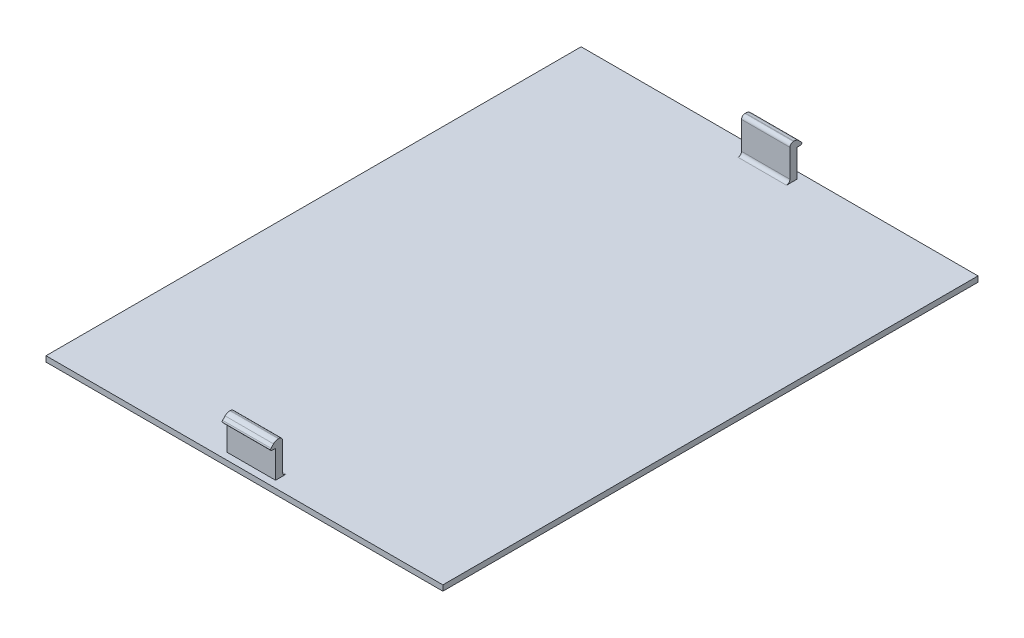
ISO-10303-21;
HEADER;
FILE_DESCRIPTION(('STEP AP214'),'2;1');
FILE_NAME('part.step','',(''),(''),'','','');
FILE_SCHEMA(('AUTOMOTIVE_DESIGN { 1 0 10303 214 1 1 1 1 }'));
ENDSEC;
DATA;
#1=APPLICATION_CONTEXT('core data for automotive mechanical design processes');
#2=APPLICATION_PROTOCOL_DEFINITION('international standard','automotive_design',2000,#1);
#3=PRODUCT_CONTEXT('',#1,'mechanical');
#4=PRODUCT('Part','Part','',(#3));
#5=PRODUCT_RELATED_PRODUCT_CATEGORY('part','',(#4));
#6=PRODUCT_DEFINITION_FORMATION('','',#4);
#7=PRODUCT_DEFINITION_CONTEXT('part definition',#1,'design');
#8=PRODUCT_DEFINITION('design','',#6,#7);
#9=PRODUCT_DEFINITION_SHAPE('','',#8);
#10=(LENGTH_UNIT() NAMED_UNIT(*) SI_UNIT(.MILLI.,.METRE.));
#11=(NAMED_UNIT(*) PLANE_ANGLE_UNIT() SI_UNIT($,.RADIAN.));
#12=(NAMED_UNIT(*) SI_UNIT($,.STERADIAN.) SOLID_ANGLE_UNIT());
#13=UNCERTAINTY_MEASURE_WITH_UNIT(LENGTH_MEASURE(1.E-05),#10,'distance_accuracy_value','');
#14=(GEOMETRIC_REPRESENTATION_CONTEXT(3) GLOBAL_UNCERTAINTY_ASSIGNED_CONTEXT((#13)) GLOBAL_UNIT_ASSIGNED_CONTEXT((#10,
#11,#12)) REPRESENTATION_CONTEXT('',''));
#15=CARTESIAN_POINT('',(0.,0.,0.));
#16=DIRECTION('',(0.,0.,1.));
#17=DIRECTION('',(1.,0.,0.));
#18=AXIS2_PLACEMENT_3D('',#15,#16,#17);
#19=CARTESIAN_POINT('',(0.,0.8,0.));
#20=DIRECTION('',(0.,1.,0.));
#21=DIRECTION('',(0.,0.,1.));
#22=AXIS2_PLACEMENT_3D('',#19,#20,#21);
#23=PLANE('',#22);
#24=DIRECTION('',(-1.,0.,0.));
#25=VECTOR('',#24,1.);
#26=CARTESIAN_POINT('',(0.,0.8,-36.2));
#27=LINE('',#26,#25);
#28=CARTESIAN_POINT('',(3.5,0.8,-36.2));
#29=VERTEX_POINT('',#28);
#30=CARTESIAN_POINT('',(-3.5,0.8,-36.2));
#31=VERTEX_POINT('',#30);
#32=EDGE_CURVE('E367',#29,#31,#27,.T.);
#33=ORIENTED_EDGE('',*,*,#32,.T.);
#34=DIRECTION('',(0.,0.,-1.));
#35=VECTOR('',#34,1.);
#36=CARTESIAN_POINT('',(-3.5,0.8,-36.7));
#37=LINE('',#36,#35);
#38=CARTESIAN_POINT('',(-3.5,0.8,-37.7));
#39=VERTEX_POINT('',#38);
#40=EDGE_CURVE('E218',#31,#39,#37,.T.);
#41=ORIENTED_EDGE('',*,*,#40,.T.);
#42=DIRECTION('',(-1.,0.,0.));
#43=VECTOR('',#42,1.);
#44=CARTESIAN_POINT('',(3.5,0.8,-37.7));
#45=LINE('',#44,#43);
#46=CARTESIAN_POINT('',(3.5,0.8,-37.7));
#47=VERTEX_POINT('',#46);
#48=EDGE_CURVE('E266',#47,#39,#45,.T.);
#49=ORIENTED_EDGE('',*,*,#48,.F.);
#50=DIRECTION('',(0.,0.,-1.));
#51=VECTOR('',#50,1.);
#52=CARTESIAN_POINT('',(3.5,0.8,-36.7));
#53=LINE('',#52,#51);
#54=EDGE_CURVE('E238',#29,#47,#53,.T.);
#55=ORIENTED_EDGE('',*,*,#54,.F.);
#56=EDGE_LOOP('',(#33,#41,#49,#55));
#57=FACE_BOUND('',#56,.T.);
#58=DIRECTION('',(0.,0.,1.));
#59=VECTOR('',#58,1.);
#60=CARTESIAN_POINT('',(-28.7,0.8,-38.7));
#61=LINE('',#60,#59);
#62=CARTESIAN_POINT('',(-28.7,0.8,-38.7));
#63=VERTEX_POINT('',#62);
#64=CARTESIAN_POINT('',(-28.7,0.8,38.7));
#65=VERTEX_POINT('',#64);
#66=EDGE_CURVE('E269',#63,#65,#61,.T.);
#67=ORIENTED_EDGE('',*,*,#66,.T.);
#68=DIRECTION('',(1.,0.,0.));
#69=VECTOR('',#68,1.);
#70=CARTESIAN_POINT('',(-28.7,0.8,38.7));
#71=LINE('',#70,#69);
#72=CARTESIAN_POINT('',(28.7,0.8,38.7));
#73=VERTEX_POINT('',#72);
#74=EDGE_CURVE('E272',#65,#73,#71,.T.);
#75=ORIENTED_EDGE('',*,*,#74,.T.);
#76=DIRECTION('',(0.,0.,-1.));
#77=VECTOR('',#76,1.);
#78=CARTESIAN_POINT('',(28.7,0.8,-38.7));
#79=LINE('',#78,#77);
#80=CARTESIAN_POINT('',(28.7,0.8,-38.7));
#81=VERTEX_POINT('',#80);
#82=EDGE_CURVE('E275',#73,#81,#79,.T.);
#83=ORIENTED_EDGE('',*,*,#82,.T.);
#84=DIRECTION('',(-1.,0.,0.));
#85=VECTOR('',#84,1.);
#86=CARTESIAN_POINT('',(-28.7,0.8,-38.7));
#87=LINE('',#86,#85);
#88=EDGE_CURVE('E277',#81,#63,#87,.T.);
#89=ORIENTED_EDGE('',*,*,#88,.T.);
#90=EDGE_LOOP('',(#67,#75,#83,#89));
#91=FACE_BOUND('',#90,.T.);
#92=DIRECTION('',(0.,0.,-1.));
#93=VECTOR('',#92,1.);
#94=CARTESIAN_POINT('',(-3.5,0.8,36.7));
#95=LINE('',#94,#93);
#96=CARTESIAN_POINT('',(-3.5,0.8,37.7));
#97=VERTEX_POINT('',#96);
#98=CARTESIAN_POINT('',(-3.5,0.8,36.2));
#99=VERTEX_POINT('',#98);
#100=EDGE_CURVE('E234',#97,#99,#95,.T.);
#101=ORIENTED_EDGE('',*,*,#100,.T.);
#102=DIRECTION('',(-1.,0.,0.));
#103=VECTOR('',#102,1.);
#104=CARTESIAN_POINT('',(0.,0.8,36.2));
#105=LINE('',#104,#103);
#106=CARTESIAN_POINT('',(3.5,0.8,36.2));
#107=VERTEX_POINT('',#106);
#108=EDGE_CURVE('E370',#99,#107,#105,.F.);
#109=ORIENTED_EDGE('',*,*,#108,.T.);
#110=DIRECTION('',(0.,0.,-1.));
#111=VECTOR('',#110,1.);
#112=CARTESIAN_POINT('',(3.5,0.8,36.7));
#113=LINE('',#112,#111);
#114=CARTESIAN_POINT('',(3.5,0.8,37.7));
#115=VERTEX_POINT('',#114);
#116=EDGE_CURVE('E222',#115,#107,#113,.T.);
#117=ORIENTED_EDGE('',*,*,#116,.F.);
#118=DIRECTION('',(-1.,0.,0.));
#119=VECTOR('',#118,1.);
#120=CARTESIAN_POINT('',(3.5,0.8,37.7));
#121=LINE('',#120,#119);
#122=EDGE_CURVE('E219',#115,#97,#121,.T.);
#123=ORIENTED_EDGE('',*,*,#122,.T.);
#124=EDGE_LOOP('',(#101,#109,#117,#123));
#125=FACE_BOUND('',#124,.T.);
#126=ADVANCED_FACE('F35',(#57,#91,#125),#23,.T.);
#127=CARTESIAN_POINT('',(-28.7,0.8,-38.7));
#128=DIRECTION('',(1.,0.,0.));
#129=DIRECTION('',(0.,0.,-1.));
#130=AXIS2_PLACEMENT_3D('',#127,#128,#129);
#131=PLANE('',#130);
#132=DIRECTION('',(0.,0.,1.));
#133=VECTOR('',#132,1.);
#134=CARTESIAN_POINT('',(-28.7,0.,-38.7));
#135=LINE('',#134,#133);
#136=CARTESIAN_POINT('',(-28.7,0.,-38.7));
#137=VERTEX_POINT('',#136);
#138=CARTESIAN_POINT('',(-28.7,0.,38.7));
#139=VERTEX_POINT('',#138);
#140=EDGE_CURVE('E268',#137,#139,#135,.T.);
#141=ORIENTED_EDGE('',*,*,#140,.T.);
#142=DIRECTION('',(0.,-1.,0.));
#143=VECTOR('',#142,1.);
#144=CARTESIAN_POINT('',(-28.7,0.8,38.7));
#145=LINE('',#144,#143);
#146=EDGE_CURVE('E295',#65,#139,#145,.T.);
#147=ORIENTED_EDGE('',*,*,#146,.F.);
#148=ORIENTED_EDGE('',*,*,#66,.F.);
#149=DIRECTION('',(0.,-1.,0.));
#150=VECTOR('',#149,1.);
#151=CARTESIAN_POINT('',(-28.7,0.8,-38.7));
#152=LINE('',#151,#150);
#153=EDGE_CURVE('E279',#63,#137,#152,.T.);
#154=ORIENTED_EDGE('',*,*,#153,.T.);
#155=EDGE_LOOP('',(#141,#147,#148,#154));
#156=FACE_BOUND('',#155,.T.);
#157=ADVANCED_FACE('F425',(#156),#131,.F.);
#158=CARTESIAN_POINT('',(-28.7,0.8,38.7));
#159=DIRECTION('',(0.,0.,-1.));
#160=DIRECTION('',(-1.,0.,0.));
#161=AXIS2_PLACEMENT_3D('',#158,#159,#160);
#162=PLANE('',#161);
#163=DIRECTION('',(1.,0.,0.));
#164=VECTOR('',#163,1.);
#165=CARTESIAN_POINT('',(-28.7,0.,38.7));
#166=LINE('',#165,#164);
#167=CARTESIAN_POINT('',(28.7,0.,38.7));
#168=VERTEX_POINT('',#167);
#169=EDGE_CURVE('E282',#139,#168,#166,.T.);
#170=ORIENTED_EDGE('',*,*,#169,.T.);
#171=DIRECTION('',(0.,-1.,0.));
#172=VECTOR('',#171,1.);
#173=CARTESIAN_POINT('',(28.7,0.8,38.7));
#174=LINE('',#173,#172);
#175=EDGE_CURVE('E292',#73,#168,#174,.T.);
#176=ORIENTED_EDGE('',*,*,#175,.F.);
#177=ORIENTED_EDGE('',*,*,#74,.F.);
#178=ORIENTED_EDGE('',*,*,#146,.T.);
#179=EDGE_LOOP('',(#170,#176,#177,#178));
#180=FACE_BOUND('',#179,.T.);
#181=ADVANCED_FACE('F433',(#180),#162,.F.);
#182=CARTESIAN_POINT('',(28.7,0.8,-38.7));
#183=DIRECTION('',(-1.,0.,0.));
#184=DIRECTION('',(0.,0.,1.));
#185=AXIS2_PLACEMENT_3D('',#182,#183,#184);
#186=PLANE('',#185);
#187=DIRECTION('',(0.,0.,-1.));
#188=VECTOR('',#187,1.);
#189=CARTESIAN_POINT('',(28.7,0.,-38.7));
#190=LINE('',#189,#188);
#191=CARTESIAN_POINT('',(28.7,0.,-38.7));
#192=VERTEX_POINT('',#191);
#193=EDGE_CURVE('E284',#168,#192,#190,.T.);
#194=ORIENTED_EDGE('',*,*,#193,.T.);
#195=DIRECTION('',(0.,-1.,0.));
#196=VECTOR('',#195,1.);
#197=CARTESIAN_POINT('',(28.7,0.8,-38.7));
#198=LINE('',#197,#196);
#199=EDGE_CURVE('E289',#81,#192,#198,.T.);
#200=ORIENTED_EDGE('',*,*,#199,.F.);
#201=ORIENTED_EDGE('',*,*,#82,.F.);
#202=ORIENTED_EDGE('',*,*,#175,.T.);
#203=EDGE_LOOP('',(#194,#200,#201,#202));
#204=FACE_BOUND('',#203,.T.);
#205=ADVANCED_FACE('F448',(#204),#186,.F.);
#206=CARTESIAN_POINT('',(-28.7,0.8,-38.7));
#207=DIRECTION('',(0.,0.,1.));
#208=DIRECTION('',(1.,0.,0.));
#209=AXIS2_PLACEMENT_3D('',#206,#207,#208);
#210=PLANE('',#209);
#211=DIRECTION('',(-1.,0.,0.));
#212=VECTOR('',#211,1.);
#213=CARTESIAN_POINT('',(-28.7,0.,-38.7));
#214=LINE('',#213,#212);
#215=EDGE_CURVE('E273',#192,#137,#214,.T.);
#216=ORIENTED_EDGE('',*,*,#215,.T.);
#217=ORIENTED_EDGE('',*,*,#153,.F.);
#218=ORIENTED_EDGE('',*,*,#88,.F.);
#219=ORIENTED_EDGE('',*,*,#199,.T.);
#220=EDGE_LOOP('',(#216,#217,#218,#219));
#221=FACE_BOUND('',#220,.T.);
#222=ADVANCED_FACE('F444',(#221),#210,.F.);
#223=CARTESIAN_POINT('',(0.,0.,0.));
#224=DIRECTION('',(0.,1.,0.));
#225=DIRECTION('',(0.,0.,1.));
#226=AXIS2_PLACEMENT_3D('',#223,#224,#225);
#227=PLANE('',#226);
#228=ORIENTED_EDGE('',*,*,#140,.F.);
#229=ORIENTED_EDGE('',*,*,#215,.F.);
#230=ORIENTED_EDGE('',*,*,#193,.F.);
#231=ORIENTED_EDGE('',*,*,#169,.F.);
#232=EDGE_LOOP('',(#228,#229,#230,#231));
#233=FACE_BOUND('',#232,.T.);
#234=ADVANCED_FACE('F441',(#233),#227,.F.);
#235=CARTESIAN_POINT('',(3.5,0.8,-37.7));
#236=DIRECTION('',(0.,0.,1.));
#237=DIRECTION('',(1.,0.,0.));
#238=AXIS2_PLACEMENT_3D('',#235,#236,#237);
#239=PLANE('',#238);
#240=DIRECTION('',(0.,1.,0.));
#241=VECTOR('',#240,1.);
#242=CARTESIAN_POINT('',(-3.5,0.8,-37.7));
#243=LINE('',#242,#241);
#244=CARTESIAN_POINT('',(-3.5,4.8,-37.7));
#245=VERTEX_POINT('',#244);
#246=EDGE_CURVE('E255',#39,#245,#243,.T.);
#247=ORIENTED_EDGE('',*,*,#246,.T.);
#248=DIRECTION('',(-1.,0.,0.));
#249=VECTOR('',#248,1.);
#250=CARTESIAN_POINT('',(3.5,4.8,-37.7));
#251=LINE('',#250,#249);
#252=CARTESIAN_POINT('',(3.5,4.8,-37.7));
#253=VERTEX_POINT('',#252);
#254=EDGE_CURVE('E252',#253,#245,#251,.T.);
#255=ORIENTED_EDGE('',*,*,#254,.F.);
#256=DIRECTION('',(0.,1.,0.));
#257=VECTOR('',#256,1.);
#258=CARTESIAN_POINT('',(3.5,0.8,-37.7));
#259=LINE('',#258,#257);
#260=EDGE_CURVE('E241',#47,#253,#259,.T.);
#261=ORIENTED_EDGE('',*,*,#260,.F.);
#262=ORIENTED_EDGE('',*,*,#48,.T.);
#263=EDGE_LOOP('',(#247,#255,#261,#262));
#264=FACE_BOUND('',#263,.T.);
#265=ADVANCED_FACE('F439',(#264),#239,.F.);
#266=CARTESIAN_POINT('',(3.5,4.8,-38.7));
#267=DIRECTION('',(0.,1.,0.));
#268=DIRECTION('',(0.,0.,1.));
#269=AXIS2_PLACEMENT_3D('',#266,#267,#268);
#270=PLANE('',#269);
#271=DIRECTION('',(0.,0.,-1.));
#272=VECTOR('',#271,1.);
#273=CARTESIAN_POINT('',(-3.5,4.8,-38.7));
#274=LINE('',#273,#272);
#275=CARTESIAN_POINT('',(-3.5,4.8,-38.2171572875254));
#276=VERTEX_POINT('',#275);
#277=EDGE_CURVE('E257',#245,#276,#274,.T.);
#278=ORIENTED_EDGE('',*,*,#277,.T.);
#279=DIRECTION('',(1.,0.,0.));
#280=VECTOR('',#279,1.);
#281=CARTESIAN_POINT('',(3.5,4.8,-38.2171572875254));
#282=LINE('',#281,#280);
#283=CARTESIAN_POINT('',(3.5,4.8,-38.2171572875254));
#284=VERTEX_POINT('',#283);
#285=EDGE_CURVE('E321',#276,#284,#282,.T.);
#286=ORIENTED_EDGE('',*,*,#285,.T.);
#287=DIRECTION('',(0.,0.,-1.));
#288=VECTOR('',#287,1.);
#289=CARTESIAN_POINT('',(3.5,4.8,-38.7));
#290=LINE('',#289,#288);
#291=EDGE_CURVE('E244',#253,#284,#290,.T.);
#292=ORIENTED_EDGE('',*,*,#291,.F.);
#293=ORIENTED_EDGE('',*,*,#254,.T.);
#294=EDGE_LOOP('',(#278,#286,#292,#293));
#295=FACE_BOUND('',#294,.T.);
#296=ADVANCED_FACE('F503',(#295),#270,.F.);
#297=CARTESIAN_POINT('',(3.5,5.8,-37.7));
#298=DIRECTION('',(0.,-1.,0.));
#299=DIRECTION('',(0.,0.,-1.));
#300=AXIS2_PLACEMENT_3D('',#297,#298,#299);
#301=PLANE('',#300);
#302=DIRECTION('',(0.,0.,1.));
#303=VECTOR('',#302,1.);
#304=CARTESIAN_POINT('',(-3.5,5.8,-37.7));
#305=LINE('',#304,#303);
#306=CARTESIAN_POINT('',(-3.5,5.8,-37.2857864376269));
#307=VERTEX_POINT('',#306);
#308=CARTESIAN_POINT('',(-3.5,5.8,-37.2));
#309=VERTEX_POINT('',#308);
#310=EDGE_CURVE('E260',#307,#309,#305,.T.);
#311=ORIENTED_EDGE('',*,*,#310,.T.);
#312=DIRECTION('',(-1.,0.,0.));
#313=VECTOR('',#312,1.);
#314=CARTESIAN_POINT('',(3.5,5.8,-37.2));
#315=LINE('',#314,#313);
#316=CARTESIAN_POINT('',(3.5,5.8,-37.2));
#317=VERTEX_POINT('',#316);
#318=EDGE_CURVE('E349',#309,#317,#315,.F.);
#319=ORIENTED_EDGE('',*,*,#318,.T.);
#320=DIRECTION('',(0.,0.,1.));
#321=VECTOR('',#320,1.);
#322=CARTESIAN_POINT('',(3.5,5.8,-37.7));
#323=LINE('',#322,#321);
#324=CARTESIAN_POINT('',(3.5,5.8,-37.2857864376269));
#325=VERTEX_POINT('',#324);
#326=EDGE_CURVE('E247',#325,#317,#323,.T.);
#327=ORIENTED_EDGE('',*,*,#326,.F.);
#328=DIRECTION('',(1.,0.,0.));
#329=VECTOR('',#328,1.);
#330=CARTESIAN_POINT('',(-3.5,5.8,-37.2857864376269));
#331=LINE('',#330,#329);
#332=EDGE_CURVE('E335',#325,#307,#331,.F.);
#333=ORIENTED_EDGE('',*,*,#332,.T.);
#334=EDGE_LOOP('',(#311,#319,#327,#333));
#335=FACE_BOUND('',#334,.T.);
#336=ADVANCED_FACE('F483',(#335),#301,.F.);
#337=CARTESIAN_POINT('',(3.5,5.8,-36.7));
#338=DIRECTION('',(0.,0.,-1.));
#339=DIRECTION('',(-1.,0.,0.));
#340=AXIS2_PLACEMENT_3D('',#337,#338,#339);
#341=PLANE('',#340);
#342=DIRECTION('',(0.,-1.,0.));
#343=VECTOR('',#342,1.);
#344=CARTESIAN_POINT('',(-3.5,5.8,-36.7));
#345=LINE('',#344,#343);
#346=CARTESIAN_POINT('',(-3.5,5.3,-36.7));
#347=VERTEX_POINT('',#346);
#348=CARTESIAN_POINT('',(-3.5,1.3,-36.7));
#349=VERTEX_POINT('',#348);
#350=EDGE_CURVE('E242',#347,#349,#345,.T.);
#351=ORIENTED_EDGE('',*,*,#350,.T.);
#352=DIRECTION('',(-1.,0.,0.));
#353=VECTOR('',#352,1.);
#354=CARTESIAN_POINT('',(3.5,1.3,-36.7));
#355=LINE('',#354,#353);
#356=CARTESIAN_POINT('',(3.5,1.3,-36.7));
#357=VERTEX_POINT('',#356);
#358=EDGE_CURVE('E56',#349,#357,#355,.F.);
#359=ORIENTED_EDGE('',*,*,#358,.T.);
#360=DIRECTION('',(0.,-1.,0.));
#361=VECTOR('',#360,1.);
#362=CARTESIAN_POINT('',(3.5,5.8,-36.7));
#363=LINE('',#362,#361);
#364=CARTESIAN_POINT('',(3.5,5.3,-36.7));
#365=VERTEX_POINT('',#364);
#366=EDGE_CURVE('E250',#365,#357,#363,.T.);
#367=ORIENTED_EDGE('',*,*,#366,.F.);
#368=DIRECTION('',(-1.,0.,0.));
#369=VECTOR('',#368,1.);
#370=CARTESIAN_POINT('',(3.5,5.3,-36.7));
#371=LINE('',#370,#369);
#372=EDGE_CURVE('E344',#365,#347,#371,.T.);
#373=ORIENTED_EDGE('',*,*,#372,.T.);
#374=EDGE_LOOP('',(#351,#359,#367,#373));
#375=FACE_BOUND('',#374,.T.);
#376=ADVANCED_FACE('F490',(#375),#341,.F.);
#377=CARTESIAN_POINT('',(3.5,0.,0.));
#378=DIRECTION('',(1.,0.,0.));
#379=DIRECTION('',(0.,0.,-1.));
#380=AXIS2_PLACEMENT_3D('',#377,#378,#379);
#381=PLANE('',#380);
#382=ORIENTED_EDGE('',*,*,#326,.T.);
#383=CARTESIAN_POINT('',(3.5,5.3,-37.2));
#384=DIRECTION('',(1.,0.,0.));
#385=DIRECTION('',(0.,0.,-1.));
#386=AXIS2_PLACEMENT_3D('',#383,#384,#385);
#387=CIRCLE('',#386,0.5);
#388=EDGE_CURVE('E351',#317,#365,#387,.T.);
#389=ORIENTED_EDGE('',*,*,#388,.T.);
#390=ORIENTED_EDGE('',*,*,#366,.T.);
#391=CARTESIAN_POINT('',(3.5,1.3,-36.2));
#392=DIRECTION('',(1.,0.,0.));
#393=DIRECTION('',(0.,0.,-1.));
#394=AXIS2_PLACEMENT_3D('',#391,#392,#393);
#395=CIRCLE('',#394,0.5);
#396=EDGE_CURVE('E11',#357,#29,#395,.F.);
#397=ORIENTED_EDGE('',*,*,#396,.T.);
#398=ORIENTED_EDGE('',*,*,#54,.T.);
#399=ORIENTED_EDGE('',*,*,#260,.T.);
#400=ORIENTED_EDGE('',*,*,#291,.T.);
#401=CARTESIAN_POINT('',(3.5,5.,-38.2171572875254));
#402=DIRECTION('',(1.,0.,0.));
#403=DIRECTION('',(0.,0.,-1.));
#404=AXIS2_PLACEMENT_3D('',#401,#402,#403);
#405=CIRCLE('',#404,0.2);
#406=CARTESIAN_POINT('',(3.5,5.14142135623731,-38.3585786437627));
#407=VERTEX_POINT('',#406);
#408=EDGE_CURVE('E323',#284,#407,#405,.T.);
#409=ORIENTED_EDGE('',*,*,#408,.T.);
#410=DIRECTION('',(0.,-0.707106781186548,-0.707106781186548));
#411=VECTOR('',#410,1.);
#412=CARTESIAN_POINT('',(3.5,21.75,-21.75));
#413=LINE('',#412,#411);
#414=CARTESIAN_POINT('',(3.5,5.50710678118654,-37.9928932188135));
#415=VERTEX_POINT('',#414);
#416=EDGE_CURVE('E300',#407,#415,#413,.F.);
#417=ORIENTED_EDGE('',*,*,#416,.T.);
#418=CARTESIAN_POINT('',(3.5,4.8,-37.2857864376269));
#419=DIRECTION('',(1.,0.,0.));
#420=DIRECTION('',(0.,0.,-1.));
#421=AXIS2_PLACEMENT_3D('',#418,#419,#420);
#422=CIRCLE('',#421,1.);
#423=EDGE_CURVE('E342',#415,#325,#422,.T.);
#424=ORIENTED_EDGE('',*,*,#423,.T.);
#425=EDGE_LOOP('',(#382,#389,#390,#397,#398,#399,#400,#409,#417,#424));
#426=FACE_BOUND('',#425,.T.);
#427=ADVANCED_FACE('F480',(#426),#381,.T.);
#428=CARTESIAN_POINT('',(-3.5,0.,0.));
#429=DIRECTION('',(1.,0.,0.));
#430=DIRECTION('',(0.,0.,-1.));
#431=AXIS2_PLACEMENT_3D('',#428,#429,#430);
#432=PLANE('',#431);
#433=ORIENTED_EDGE('',*,*,#350,.F.);
#434=CARTESIAN_POINT('',(-3.5,5.3,-37.2));
#435=DIRECTION('',(1.,0.,0.));
#436=DIRECTION('',(0.,0.,-1.));
#437=AXIS2_PLACEMENT_3D('',#434,#435,#436);
#438=CIRCLE('',#437,0.5);
#439=EDGE_CURVE('E347',#347,#309,#438,.F.);
#440=ORIENTED_EDGE('',*,*,#439,.T.);
#441=ORIENTED_EDGE('',*,*,#310,.F.);
#442=CARTESIAN_POINT('',(-3.5,4.8,-37.2857864376269));
#443=DIRECTION('',(1.,0.,0.));
#444=DIRECTION('',(0.,0.,-1.));
#445=AXIS2_PLACEMENT_3D('',#442,#443,#444);
#446=CIRCLE('',#445,1.);
#447=CARTESIAN_POINT('',(-3.5,5.50710678118654,-37.9928932188135));
#448=VERTEX_POINT('',#447);
#449=EDGE_CURVE('E338',#307,#448,#446,.F.);
#450=ORIENTED_EDGE('',*,*,#449,.T.);
#451=DIRECTION('',(0.,0.707106781186548,0.707106781186548));
#452=VECTOR('',#451,1.);
#453=CARTESIAN_POINT('',(-3.5,5.8,-37.7));
#454=LINE('',#453,#452);
#455=CARTESIAN_POINT('',(-3.5,5.14142135623731,-38.3585786437627));
#456=VERTEX_POINT('',#455);
#457=EDGE_CURVE('E298',#448,#456,#454,.F.);
#458=ORIENTED_EDGE('',*,*,#457,.T.);
#459=CARTESIAN_POINT('',(-3.5,5.,-38.2171572875254));
#460=DIRECTION('',(1.,0.,0.));
#461=DIRECTION('',(0.,0.,-1.));
#462=AXIS2_PLACEMENT_3D('',#459,#460,#461);
#463=CIRCLE('',#462,0.2);
#464=EDGE_CURVE('E319',#456,#276,#463,.F.);
#465=ORIENTED_EDGE('',*,*,#464,.T.);
#466=ORIENTED_EDGE('',*,*,#277,.F.);
#467=ORIENTED_EDGE('',*,*,#246,.F.);
#468=ORIENTED_EDGE('',*,*,#40,.F.);
#469=CARTESIAN_POINT('',(-3.5,1.3,-36.2));
#470=DIRECTION('',(1.,0.,0.));
#471=DIRECTION('',(0.,0.,-1.));
#472=AXIS2_PLACEMENT_3D('',#469,#470,#471);
#473=CIRCLE('',#472,0.5);
#474=EDGE_CURVE('E43',#31,#349,#473,.T.);
#475=ORIENTED_EDGE('',*,*,#474,.T.);
#476=EDGE_LOOP('',(#433,#440,#441,#450,#458,#465,#466,#467,#468,#475));
#477=FACE_BOUND('',#476,.T.);
#478=ADVANCED_FACE('F491',(#477),#432,.F.);
#479=CARTESIAN_POINT('',(3.5,5.8,36.7));
#480=DIRECTION('',(0.,0.,1.));
#481=DIRECTION('',(1.,0.,0.));
#482=AXIS2_PLACEMENT_3D('',#479,#480,#481);
#483=PLANE('',#482);
#484=DIRECTION('',(0.,1.,0.));
#485=VECTOR('',#484,1.);
#486=CARTESIAN_POINT('',(3.5,5.8,36.7));
#487=LINE('',#486,#485);
#488=CARTESIAN_POINT('',(3.5,1.3,36.7));
#489=VERTEX_POINT('',#488);
#490=CARTESIAN_POINT('',(3.5,5.3,36.7));
#491=VERTEX_POINT('',#490);
#492=EDGE_CURVE('E236',#489,#491,#487,.T.);
#493=ORIENTED_EDGE('',*,*,#492,.F.);
#494=DIRECTION('',(-1.,0.,0.));
#495=VECTOR('',#494,1.);
#496=CARTESIAN_POINT('',(3.5,1.3,36.7));
#497=LINE('',#496,#495);
#498=CARTESIAN_POINT('',(-3.5,1.3,36.7));
#499=VERTEX_POINT('',#498);
#500=EDGE_CURVE('E364',#489,#499,#497,.T.);
#501=ORIENTED_EDGE('',*,*,#500,.T.);
#502=DIRECTION('',(0.,1.,0.));
#503=VECTOR('',#502,1.);
#504=CARTESIAN_POINT('',(-3.5,5.8,36.7));
#505=LINE('',#504,#503);
#506=CARTESIAN_POINT('',(-3.5,5.3,36.7));
#507=VERTEX_POINT('',#506);
#508=EDGE_CURVE('E227',#499,#507,#505,.T.);
#509=ORIENTED_EDGE('',*,*,#508,.T.);
#510=DIRECTION('',(-1.,0.,0.));
#511=VECTOR('',#510,1.);
#512=CARTESIAN_POINT('',(3.5,5.3,36.7));
#513=LINE('',#512,#511);
#514=EDGE_CURVE('E359',#507,#491,#513,.F.);
#515=ORIENTED_EDGE('',*,*,#514,.T.);
#516=EDGE_LOOP('',(#493,#501,#509,#515));
#517=FACE_BOUND('',#516,.T.);
#518=ADVANCED_FACE('F384',(#517),#483,.F.);
#519=CARTESIAN_POINT('',(3.5,5.8,37.7));
#520=DIRECTION('',(0.,-1.,0.));
#521=DIRECTION('',(0.,0.,-1.));
#522=AXIS2_PLACEMENT_3D('',#519,#520,#521);
#523=PLANE('',#522);
#524=DIRECTION('',(0.,0.,1.));
#525=VECTOR('',#524,1.);
#526=CARTESIAN_POINT('',(3.5,5.8,37.7));
#527=LINE('',#526,#525);
#528=CARTESIAN_POINT('',(3.5,5.8,37.2));
#529=VERTEX_POINT('',#528);
#530=CARTESIAN_POINT('',(3.5,5.8,37.2857864376269));
#531=VERTEX_POINT('',#530);
#532=EDGE_CURVE('E208',#529,#531,#527,.T.);
#533=ORIENTED_EDGE('',*,*,#532,.F.);
#534=DIRECTION('',(-1.,0.,0.));
#535=VECTOR('',#534,1.);
#536=CARTESIAN_POINT('',(3.5,5.8,37.2));
#537=LINE('',#536,#535);
#538=CARTESIAN_POINT('',(-3.5,5.8,37.2));
#539=VERTEX_POINT('',#538);
#540=EDGE_CURVE('E353',#529,#539,#537,.T.);
#541=ORIENTED_EDGE('',*,*,#540,.T.);
#542=DIRECTION('',(0.,0.,1.));
#543=VECTOR('',#542,1.);
#544=CARTESIAN_POINT('',(-3.5,5.8,37.7));
#545=LINE('',#544,#543);
#546=CARTESIAN_POINT('',(-3.5,5.8,37.2857864376269));
#547=VERTEX_POINT('',#546);
#548=EDGE_CURVE('E229',#539,#547,#545,.T.);
#549=ORIENTED_EDGE('',*,*,#548,.T.);
#550=DIRECTION('',(-1.,0.,0.));
#551=VECTOR('',#550,1.);
#552=CARTESIAN_POINT('',(3.5,5.8,37.2857864376269));
#553=LINE('',#552,#551);
#554=EDGE_CURVE('E325',#547,#531,#553,.F.);
#555=ORIENTED_EDGE('',*,*,#554,.T.);
#556=EDGE_LOOP('',(#533,#541,#549,#555));
#557=FACE_BOUND('',#556,.T.);
#558=ADVANCED_FACE('F400',(#557),#523,.F.);
#559=CARTESIAN_POINT('',(3.5,4.8,38.7));
#560=DIRECTION('',(0.,1.,0.));
#561=DIRECTION('',(0.,0.,1.));
#562=AXIS2_PLACEMENT_3D('',#559,#560,#561);
#563=PLANE('',#562);
#564=DIRECTION('',(0.,0.,-1.));
#565=VECTOR('',#564,1.);
#566=CARTESIAN_POINT('',(3.5,4.8,38.7));
#567=LINE('',#566,#565);
#568=CARTESIAN_POINT('',(3.5,4.8,38.2171572875254));
#569=VERTEX_POINT('',#568);
#570=CARTESIAN_POINT('',(3.5,4.8,37.7));
#571=VERTEX_POINT('',#570);
#572=EDGE_CURVE('E197',#569,#571,#567,.T.);
#573=ORIENTED_EDGE('',*,*,#572,.F.);
#574=DIRECTION('',(1.,0.,0.));
#575=VECTOR('',#574,1.);
#576=CARTESIAN_POINT('',(-3.5,4.8,38.2171572875254));
#577=LINE('',#576,#575);
#578=CARTESIAN_POINT('',(-3.5,4.8,38.2171572875254));
#579=VERTEX_POINT('',#578);
#580=EDGE_CURVE('E308',#569,#579,#577,.F.);
#581=ORIENTED_EDGE('',*,*,#580,.T.);
#582=DIRECTION('',(0.,0.,-1.));
#583=VECTOR('',#582,1.);
#584=CARTESIAN_POINT('',(-3.5,4.8,38.7));
#585=LINE('',#584,#583);
#586=CARTESIAN_POINT('',(-3.5,4.8,37.7));
#587=VERTEX_POINT('',#586);
#588=EDGE_CURVE('E214',#579,#587,#585,.T.);
#589=ORIENTED_EDGE('',*,*,#588,.T.);
#590=DIRECTION('',(-1.,0.,0.));
#591=VECTOR('',#590,1.);
#592=CARTESIAN_POINT('',(3.5,4.8,37.7));
#593=LINE('',#592,#591);
#594=EDGE_CURVE('E211',#571,#587,#593,.T.);
#595=ORIENTED_EDGE('',*,*,#594,.F.);
#596=EDGE_LOOP('',(#573,#581,#589,#595));
#597=FACE_BOUND('',#596,.T.);
#598=ADVANCED_FACE('F212',(#597),#563,.F.);
#599=CARTESIAN_POINT('',(3.5,0.8,37.7));
#600=DIRECTION('',(0.,0.,-1.));
#601=DIRECTION('',(-1.,0.,0.));
#602=AXIS2_PLACEMENT_3D('',#599,#600,#601);
#603=PLANE('',#602);
#604=DIRECTION('',(0.,-1.,0.));
#605=VECTOR('',#604,1.);
#606=CARTESIAN_POINT('',(-3.5,0.8,37.7));
#607=LINE('',#606,#605);
#608=EDGE_CURVE('E232',#587,#97,#607,.T.);
#609=ORIENTED_EDGE('',*,*,#608,.T.);
#610=ORIENTED_EDGE('',*,*,#122,.F.);
#611=DIRECTION('',(0.,-1.,0.));
#612=VECTOR('',#611,1.);
#613=CARTESIAN_POINT('',(3.5,0.8,37.7));
#614=LINE('',#613,#612);
#615=EDGE_CURVE('E201',#571,#115,#614,.T.);
#616=ORIENTED_EDGE('',*,*,#615,.F.);
#617=ORIENTED_EDGE('',*,*,#594,.T.);
#618=EDGE_LOOP('',(#609,#610,#616,#617));
#619=FACE_BOUND('',#618,.T.);
#620=ADVANCED_FACE('F221',(#619),#603,.F.);
#621=CARTESIAN_POINT('',(3.5,0.,0.));
#622=DIRECTION('',(-1.,0.,0.));
#623=DIRECTION('',(0.,0.,1.));
#624=AXIS2_PLACEMENT_3D('',#621,#622,#623);
#625=PLANE('',#624);
#626=ORIENTED_EDGE('',*,*,#116,.T.);
#627=CARTESIAN_POINT('',(3.5,1.3,36.2));
#628=DIRECTION('',(-1.,0.,0.));
#629=DIRECTION('',(0.,0.,1.));
#630=AXIS2_PLACEMENT_3D('',#627,#628,#629);
#631=CIRCLE('',#630,0.5);
#632=EDGE_CURVE('E377',#107,#489,#631,.T.);
#633=ORIENTED_EDGE('',*,*,#632,.T.);
#634=ORIENTED_EDGE('',*,*,#492,.T.);
#635=CARTESIAN_POINT('',(3.5,5.3,37.2));
#636=DIRECTION('',(-1.,0.,0.));
#637=DIRECTION('',(0.,0.,1.));
#638=AXIS2_PLACEMENT_3D('',#635,#636,#637);
#639=CIRCLE('',#638,0.5);
#640=EDGE_CURVE('E362',#491,#529,#639,.F.);
#641=ORIENTED_EDGE('',*,*,#640,.T.);
#642=ORIENTED_EDGE('',*,*,#532,.T.);
#643=CARTESIAN_POINT('',(3.5,4.8,37.2857864376269));
#644=DIRECTION('',(-1.,0.,0.));
#645=DIRECTION('',(0.,0.,1.));
#646=AXIS2_PLACEMENT_3D('',#643,#644,#645);
#647=CIRCLE('',#646,1.);
#648=CARTESIAN_POINT('',(3.5,5.50710678118655,37.9928932188134));
#649=VERTEX_POINT('',#648);
#650=EDGE_CURVE('E328',#531,#649,#647,.F.);
#651=ORIENTED_EDGE('',*,*,#650,.T.);
#652=DIRECTION('',(0.,0.707106781186548,-0.707106781186548));
#653=VECTOR('',#652,1.);
#654=CARTESIAN_POINT('',(3.5,4.8,38.7));
#655=LINE('',#654,#653);
#656=CARTESIAN_POINT('',(3.5,5.14142135623731,38.3585786437627));
#657=VERTEX_POINT('',#656);
#658=EDGE_CURVE('E306',#649,#657,#655,.F.);
#659=ORIENTED_EDGE('',*,*,#658,.T.);
#660=CARTESIAN_POINT('',(3.5,5.,38.2171572875254));
#661=DIRECTION('',(-1.,0.,0.));
#662=DIRECTION('',(0.,0.,1.));
#663=AXIS2_PLACEMENT_3D('',#660,#661,#662);
#664=CIRCLE('',#663,0.2);
#665=EDGE_CURVE('E204',#657,#569,#664,.F.);
#666=ORIENTED_EDGE('',*,*,#665,.T.);
#667=ORIENTED_EDGE('',*,*,#572,.T.);
#668=ORIENTED_EDGE('',*,*,#615,.T.);
#669=EDGE_LOOP('',(#626,#633,#634,#641,#642,#651,#659,#666,#667,#668));
#670=FACE_BOUND('',#669,.T.);
#671=ADVANCED_FACE('F199',(#670),#625,.F.);
#672=CARTESIAN_POINT('',(-3.5,0.,0.));
#673=DIRECTION('',(-1.,0.,0.));
#674=DIRECTION('',(0.,0.,1.));
#675=AXIS2_PLACEMENT_3D('',#672,#673,#674);
#676=PLANE('',#675);
#677=ORIENTED_EDGE('',*,*,#548,.F.);
#678=CARTESIAN_POINT('',(-3.5,5.3,37.2));
#679=DIRECTION('',(-1.,0.,0.));
#680=DIRECTION('',(0.,0.,1.));
#681=AXIS2_PLACEMENT_3D('',#678,#679,#680);
#682=CIRCLE('',#681,0.5);
#683=EDGE_CURVE('E356',#539,#507,#682,.T.);
#684=ORIENTED_EDGE('',*,*,#683,.T.);
#685=ORIENTED_EDGE('',*,*,#508,.F.);
#686=CARTESIAN_POINT('',(-3.5,1.3,36.2));
#687=DIRECTION('',(-1.,0.,0.));
#688=DIRECTION('',(0.,0.,1.));
#689=AXIS2_PLACEMENT_3D('',#686,#687,#688);
#690=CIRCLE('',#689,0.5);
#691=EDGE_CURVE('E374',#499,#99,#690,.F.);
#692=ORIENTED_EDGE('',*,*,#691,.T.);
#693=ORIENTED_EDGE('',*,*,#100,.F.);
#694=ORIENTED_EDGE('',*,*,#608,.F.);
#695=ORIENTED_EDGE('',*,*,#588,.F.);
#696=CARTESIAN_POINT('',(-3.5,5.,38.2171572875254));
#697=DIRECTION('',(-1.,0.,0.));
#698=DIRECTION('',(0.,0.,1.));
#699=AXIS2_PLACEMENT_3D('',#696,#697,#698);
#700=CIRCLE('',#699,0.2);
#701=CARTESIAN_POINT('',(-3.5,5.14142135623731,38.3585786437627));
#702=VERTEX_POINT('',#701);
#703=EDGE_CURVE('E310',#579,#702,#700,.T.);
#704=ORIENTED_EDGE('',*,*,#703,.T.);
#705=DIRECTION('',(0.,-0.707106781186548,0.707106781186548));
#706=VECTOR('',#705,1.);
#707=CARTESIAN_POINT('',(-3.5,21.75,21.75));
#708=LINE('',#707,#706);
#709=CARTESIAN_POINT('',(-3.5,5.50710678118655,37.9928932188135));
#710=VERTEX_POINT('',#709);
#711=EDGE_CURVE('E303',#702,#710,#708,.F.);
#712=ORIENTED_EDGE('',*,*,#711,.T.);
#713=CARTESIAN_POINT('',(-3.5,4.8,37.2857864376269));
#714=DIRECTION('',(-1.,0.,0.));
#715=DIRECTION('',(0.,0.,1.));
#716=AXIS2_PLACEMENT_3D('',#713,#714,#715);
#717=CIRCLE('',#716,1.);
#718=EDGE_CURVE('E332',#710,#547,#717,.T.);
#719=ORIENTED_EDGE('',*,*,#718,.T.);
#720=EDGE_LOOP('',(#677,#684,#685,#692,#693,#694,#695,#704,#712,#719));
#721=FACE_BOUND('',#720,.T.);
#722=ADVANCED_FACE('F393',(#721),#676,.T.);
#723=CARTESIAN_POINT('',(3.5,5.8,-37.7));
#724=DIRECTION('',(0.,-0.707106781186547,0.707106781186547));
#725=DIRECTION('',(-1.,0.,0.));
#726=AXIS2_PLACEMENT_3D('',#723,#724,#725);
#727=PLANE('',#726);
#728=ORIENTED_EDGE('',*,*,#457,.F.);
#729=DIRECTION('',(-1.,0.,0.));
#730=VECTOR('',#729,1.);
#731=CARTESIAN_POINT('',(3.5,5.50710678118654,-37.9928932188135));
#732=LINE('',#731,#730);
#733=EDGE_CURVE('E340',#448,#415,#732,.F.);
#734=ORIENTED_EDGE('',*,*,#733,.T.);
#735=ORIENTED_EDGE('',*,*,#416,.F.);
#736=DIRECTION('',(-1.,0.,0.));
#737=VECTOR('',#736,1.);
#738=CARTESIAN_POINT('',(-3.5,5.14142135623731,-38.3585786437627));
#739=LINE('',#738,#737);
#740=EDGE_CURVE('E316',#407,#456,#739,.T.);
#741=ORIENTED_EDGE('',*,*,#740,.T.);
#742=EDGE_LOOP('',(#728,#734,#735,#741));
#743=FACE_BOUND('',#742,.T.);
#744=ADVANCED_FACE('F422',(#743),#727,.F.);
#745=CARTESIAN_POINT('',(3.5,4.8,38.7));
#746=DIRECTION('',(0.,-0.707106781186547,-0.707106781186547));
#747=DIRECTION('',(-1.,0.,0.));
#748=AXIS2_PLACEMENT_3D('',#745,#746,#747);
#749=PLANE('',#748);
#750=ORIENTED_EDGE('',*,*,#658,.F.);
#751=DIRECTION('',(1.,0.,0.));
#752=VECTOR('',#751,1.);
#753=CARTESIAN_POINT('',(-3.5,5.50710678118655,37.9928932188134));
#754=LINE('',#753,#752);
#755=EDGE_CURVE('E330',#649,#710,#754,.F.);
#756=ORIENTED_EDGE('',*,*,#755,.T.);
#757=ORIENTED_EDGE('',*,*,#711,.F.);
#758=DIRECTION('',(-1.,0.,0.));
#759=VECTOR('',#758,1.);
#760=CARTESIAN_POINT('',(3.5,5.14142135623731,38.3585786437627));
#761=LINE('',#760,#759);
#762=EDGE_CURVE('E312',#702,#657,#761,.F.);
#763=ORIENTED_EDGE('',*,*,#762,.T.);
#764=EDGE_LOOP('',(#750,#756,#757,#763));
#765=FACE_BOUND('',#764,.T.);
#766=ADVANCED_FACE('F408',(#765),#749,.F.);
#767=CARTESIAN_POINT('',(3.5,5.,38.2171572875254));
#768=DIRECTION('',(-1.,0.,0.));
#769=DIRECTION('',(0.,0.,1.));
#770=AXIS2_PLACEMENT_3D('',#767,#768,#769);
#771=CYLINDRICAL_SURFACE('',#770,0.2);
#772=ORIENTED_EDGE('',*,*,#665,.F.);
#773=ORIENTED_EDGE('',*,*,#762,.F.);
#774=ORIENTED_EDGE('',*,*,#703,.F.);
#775=ORIENTED_EDGE('',*,*,#580,.F.);
#776=EDGE_LOOP('',(#772,#773,#774,#775));
#777=FACE_BOUND('',#776,.T.);
#778=ADVANCED_FACE('F412',(#777),#771,.T.);
#779=CARTESIAN_POINT('',(3.5,5.,-38.2171572875254));
#780=DIRECTION('',(-1.,0.,0.));
#781=DIRECTION('',(0.,0.,1.));
#782=AXIS2_PLACEMENT_3D('',#779,#780,#781);
#783=CYLINDRICAL_SURFACE('',#782,0.2);
#784=ORIENTED_EDGE('',*,*,#408,.F.);
#785=ORIENTED_EDGE('',*,*,#285,.F.);
#786=ORIENTED_EDGE('',*,*,#464,.F.);
#787=ORIENTED_EDGE('',*,*,#740,.F.);
#788=EDGE_LOOP('',(#784,#785,#786,#787));
#789=FACE_BOUND('',#788,.T.);
#790=ADVANCED_FACE('F414',(#789),#783,.T.);
#791=CARTESIAN_POINT('',(3.5,4.8,37.2857864376269));
#792=DIRECTION('',(1.,0.,0.));
#793=DIRECTION('',(0.,0.,-1.));
#794=AXIS2_PLACEMENT_3D('',#791,#792,#793);
#795=CYLINDRICAL_SURFACE('',#794,1.);
#796=ORIENTED_EDGE('',*,*,#718,.F.);
#797=ORIENTED_EDGE('',*,*,#755,.F.);
#798=ORIENTED_EDGE('',*,*,#650,.F.);
#799=ORIENTED_EDGE('',*,*,#554,.F.);
#800=EDGE_LOOP('',(#796,#797,#798,#799));
#801=FACE_BOUND('',#800,.T.);
#802=ADVANCED_FACE('F404',(#801),#795,.T.);
#803=CARTESIAN_POINT('',(3.5,4.8,-37.2857864376269));
#804=DIRECTION('',(-1.,0.,0.));
#805=DIRECTION('',(0.,0.,1.));
#806=AXIS2_PLACEMENT_3D('',#803,#804,#805);
#807=CYLINDRICAL_SURFACE('',#806,1.);
#808=ORIENTED_EDGE('',*,*,#423,.F.);
#809=ORIENTED_EDGE('',*,*,#733,.F.);
#810=ORIENTED_EDGE('',*,*,#449,.F.);
#811=ORIENTED_EDGE('',*,*,#332,.F.);
#812=EDGE_LOOP('',(#808,#809,#810,#811));
#813=FACE_BOUND('',#812,.T.);
#814=ADVANCED_FACE('F476',(#813),#807,.T.);
#815=CARTESIAN_POINT('',(3.5,5.3,-37.2));
#816=DIRECTION('',(-1.,0.,0.));
#817=DIRECTION('',(0.,0.,1.));
#818=AXIS2_PLACEMENT_3D('',#815,#816,#817);
#819=CYLINDRICAL_SURFACE('',#818,0.5);
#820=ORIENTED_EDGE('',*,*,#388,.F.);
#821=ORIENTED_EDGE('',*,*,#318,.F.);
#822=ORIENTED_EDGE('',*,*,#439,.F.);
#823=ORIENTED_EDGE('',*,*,#372,.F.);
#824=EDGE_LOOP('',(#820,#821,#822,#823));
#825=FACE_BOUND('',#824,.T.);
#826=ADVANCED_FACE('F487',(#825),#819,.T.);
#827=CARTESIAN_POINT('',(3.5,5.3,37.2));
#828=DIRECTION('',(-1.,0.,0.));
#829=DIRECTION('',(0.,0.,1.));
#830=AXIS2_PLACEMENT_3D('',#827,#828,#829);
#831=CYLINDRICAL_SURFACE('',#830,0.5);
#832=ORIENTED_EDGE('',*,*,#640,.F.);
#833=ORIENTED_EDGE('',*,*,#514,.F.);
#834=ORIENTED_EDGE('',*,*,#683,.F.);
#835=ORIENTED_EDGE('',*,*,#540,.F.);
#836=EDGE_LOOP('',(#832,#833,#834,#835));
#837=FACE_BOUND('',#836,.T.);
#838=ADVANCED_FACE('F396',(#837),#831,.T.);
#839=CARTESIAN_POINT('',(3.5,1.3,36.2));
#840=DIRECTION('',(-1.,0.,0.));
#841=DIRECTION('',(0.,0.,1.));
#842=AXIS2_PLACEMENT_3D('',#839,#840,#841);
#843=CYLINDRICAL_SURFACE('',#842,0.5);
#844=ORIENTED_EDGE('',*,*,#632,.F.);
#845=ORIENTED_EDGE('',*,*,#108,.F.);
#846=ORIENTED_EDGE('',*,*,#691,.F.);
#847=ORIENTED_EDGE('',*,*,#500,.F.);
#848=EDGE_LOOP('',(#844,#845,#846,#847));
#849=FACE_BOUND('',#848,.T.);
#850=ADVANCED_FACE('F389',(#849),#843,.F.);
#851=CARTESIAN_POINT('',(0.,1.3,-36.2));
#852=DIRECTION('',(-1.,0.,0.));
#853=DIRECTION('',(0.,0.,1.));
#854=AXIS2_PLACEMENT_3D('',#851,#852,#853);
#855=CYLINDRICAL_SURFACE('',#854,0.5);
#856=ORIENTED_EDGE('',*,*,#396,.F.);
#857=ORIENTED_EDGE('',*,*,#358,.F.);
#858=ORIENTED_EDGE('',*,*,#474,.F.);
#859=ORIENTED_EDGE('',*,*,#32,.F.);
#860=EDGE_LOOP('',(#856,#857,#858,#859));
#861=FACE_BOUND('',#860,.T.);
#862=ADVANCED_FACE('F37',(#861),#855,.F.);
#863=CLOSED_SHELL('',(#126,#157,#181,#205,#222,#234,#265,#296,#336,#376,#427,#478,#518,#558,
#598,#620,#671,#722,#744,#766,#778,#790,#802,#814,#826,#838,#850,#862));
#864=MANIFOLD_SOLID_BREP('B2',#863);
#865=ADVANCED_BREP_SHAPE_REPRESENTATION('',(#18,#864),#14);
#866=SHAPE_DEFINITION_REPRESENTATION(#9,#865);
ENDSEC;
END-ISO-10303-21;
